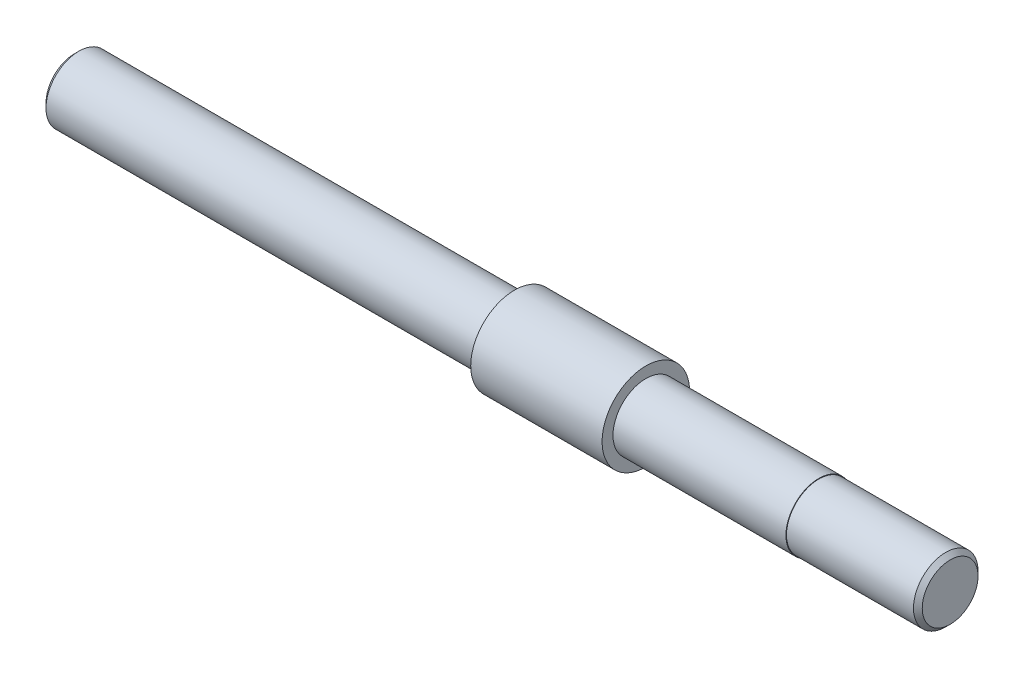
ISO-10303-21;
HEADER;
FILE_DESCRIPTION(('STEP AP214'),'2;1');
FILE_NAME('part.step','',(''),(''),'','','');
FILE_SCHEMA(('AUTOMOTIVE_DESIGN { 1 0 10303 214 1 1 1 1 }'));
ENDSEC;
DATA;
#1=APPLICATION_CONTEXT('core data for automotive mechanical design processes');
#2=APPLICATION_PROTOCOL_DEFINITION('international standard','automotive_design',2000,#1);
#3=PRODUCT_CONTEXT('',#1,'mechanical');
#4=PRODUCT('Part','Part','',(#3));
#5=PRODUCT_RELATED_PRODUCT_CATEGORY('part','',(#4));
#6=PRODUCT_DEFINITION_FORMATION('','',#4);
#7=PRODUCT_DEFINITION_CONTEXT('part definition',#1,'design');
#8=PRODUCT_DEFINITION('design','',#6,#7);
#9=PRODUCT_DEFINITION_SHAPE('','',#8);
#10=(LENGTH_UNIT() NAMED_UNIT(*) SI_UNIT(.MILLI.,.METRE.));
#11=(NAMED_UNIT(*) PLANE_ANGLE_UNIT() SI_UNIT($,.RADIAN.));
#12=(NAMED_UNIT(*) SI_UNIT($,.STERADIAN.) SOLID_ANGLE_UNIT());
#13=UNCERTAINTY_MEASURE_WITH_UNIT(LENGTH_MEASURE(1.E-05),#10,'distance_accuracy_value','');
#14=(GEOMETRIC_REPRESENTATION_CONTEXT(3) GLOBAL_UNCERTAINTY_ASSIGNED_CONTEXT((#13)) GLOBAL_UNIT_ASSIGNED_CONTEXT((#10,
#11,#12)) REPRESENTATION_CONTEXT('',''));
#15=CARTESIAN_POINT('',(0.,0.,0.));
#16=DIRECTION('',(0.,0.,1.));
#17=DIRECTION('',(1.,0.,0.));
#18=AXIS2_PLACEMENT_3D('',#15,#16,#17);
#19=CARTESIAN_POINT('',(0.,0.,0.));
#20=DIRECTION('',(-1.,0.,0.));
#21=DIRECTION('',(0.,0.,1.));
#22=AXIS2_PLACEMENT_3D('',#19,#20,#21);
#23=PLANE('',#22);
#24=CARTESIAN_POINT('',(0.,0.,0.));
#25=DIRECTION('',(-1.,0.,0.));
#26=DIRECTION('',(0.,0.,1.));
#27=AXIS2_PLACEMENT_3D('',#24,#25,#26);
#28=CIRCLE('',#27,1.275);
#29=CARTESIAN_POINT('',(0.,0.,1.275));
#30=VERTEX_POINT('',#29);
#31=EDGE_CURVE('E10',#30,#30,#28,.F.);
#32=ORIENTED_EDGE('',*,*,#31,.T.);
#33=EDGE_LOOP('',(#32));
#34=FACE_BOUND('',#33,.T.);
#35=ADVANCED_FACE('F38',(#34),#23,.F.);
#36=CARTESIAN_POINT('',(-12.0887675927148,0.,0.));
#37=DIRECTION('',(-1.,0.,0.));
#38=DIRECTION('',(0.,0.,1.));
#39=AXIS2_PLACEMENT_3D('',#36,#37,#38);
#40=CYLINDRICAL_SURFACE('',#39,1.475);
#41=CARTESIAN_POINT('',(-0.199999999999995,0.,0.));
#42=DIRECTION('',(-1.,0.,0.));
#43=DIRECTION('',(0.,0.,1.));
#44=AXIS2_PLACEMENT_3D('',#41,#42,#43);
#45=CIRCLE('',#44,1.475);
#46=CARTESIAN_POINT('',(-0.199999999999995,0.,1.475));
#47=VERTEX_POINT('',#46);
#48=EDGE_CURVE('E45',#47,#47,#45,.T.);
#49=ORIENTED_EDGE('',*,*,#48,.T.);
#50=EDGE_LOOP('',(#49));
#51=FACE_BOUND('',#50,.T.);
#52=CARTESIAN_POINT('',(-6.,0.,0.));
#53=DIRECTION('',(-1.,0.,0.));
#54=DIRECTION('',(0.,0.,1.));
#55=AXIS2_PLACEMENT_3D('',#52,#53,#54);
#56=CIRCLE('',#55,1.475);
#57=CARTESIAN_POINT('',(-6.,0.,1.475));
#58=VERTEX_POINT('',#57);
#59=EDGE_CURVE('E58',#58,#58,#56,.T.);
#60=ORIENTED_EDGE('',*,*,#59,.F.);
#61=EDGE_LOOP('',(#60));
#62=FACE_BOUND('',#61,.T.);
#63=ADVANCED_FACE('F106',(#51,#62),#40,.T.);
#64=CARTESIAN_POINT('',(-6.,1.475,0.));
#65=DIRECTION('',(-1.,0.,0.));
#66=DIRECTION('',(0.,0.,1.));
#67=AXIS2_PLACEMENT_3D('',#64,#65,#66);
#68=PLANE('',#67);
#69=CARTESIAN_POINT('',(-6.,0.,0.));
#70=DIRECTION('',(-1.,0.,0.));
#71=DIRECTION('',(0.,0.,1.));
#72=AXIS2_PLACEMENT_3D('',#69,#70,#71);
#73=CIRCLE('',#72,1.5);
#74=CARTESIAN_POINT('',(-6.,0.,1.5));
#75=VERTEX_POINT('',#74);
#76=EDGE_CURVE('E61',#75,#75,#73,.T.);
#77=ORIENTED_EDGE('',*,*,#76,.F.);
#78=EDGE_LOOP('',(#77));
#79=FACE_BOUND('',#78,.T.);
#80=ORIENTED_EDGE('',*,*,#59,.T.);
#81=EDGE_LOOP('',(#80));
#82=FACE_BOUND('',#81,.T.);
#83=ADVANCED_FACE('F100',(#79,#82),#68,.F.);
#84=CARTESIAN_POINT('',(-12.0887675927148,0.,0.));
#85=DIRECTION('',(-1.,0.,0.));
#86=DIRECTION('',(0.,0.,1.));
#87=AXIS2_PLACEMENT_3D('',#84,#85,#86);
#88=CYLINDRICAL_SURFACE('',#87,1.5);
#89=CARTESIAN_POINT('',(-13.9,0.,0.));
#90=DIRECTION('',(-1.,0.,0.));
#91=DIRECTION('',(0.,0.,1.));
#92=AXIS2_PLACEMENT_3D('',#89,#90,#91);
#93=CIRCLE('',#92,1.5);
#94=CARTESIAN_POINT('',(-13.9,0.,1.5));
#95=VERTEX_POINT('',#94);
#96=EDGE_CURVE('E64',#95,#95,#93,.T.);
#97=ORIENTED_EDGE('',*,*,#96,.F.);
#98=EDGE_LOOP('',(#97));
#99=FACE_BOUND('',#98,.T.);
#100=ORIENTED_EDGE('',*,*,#76,.T.);
#101=EDGE_LOOP('',(#100));
#102=FACE_BOUND('',#101,.T.);
#103=ADVANCED_FACE('F94',(#99,#102),#88,.T.);
#104=CARTESIAN_POINT('',(-13.9,1.5,0.));
#105=DIRECTION('',(-1.,0.,0.));
#106=DIRECTION('',(0.,0.,1.));
#107=AXIS2_PLACEMENT_3D('',#104,#105,#106);
#108=PLANE('',#107);
#109=CARTESIAN_POINT('',(-13.9,0.,0.));
#110=DIRECTION('',(-1.,0.,0.));
#111=DIRECTION('',(0.,0.,1.));
#112=AXIS2_PLACEMENT_3D('',#109,#110,#111);
#113=CIRCLE('',#112,2.);
#114=CARTESIAN_POINT('',(-13.9,0.,2.));
#115=VERTEX_POINT('',#114);
#116=EDGE_CURVE('E67',#115,#115,#113,.T.);
#117=ORIENTED_EDGE('',*,*,#116,.F.);
#118=EDGE_LOOP('',(#117));
#119=FACE_BOUND('',#118,.T.);
#120=ORIENTED_EDGE('',*,*,#96,.T.);
#121=EDGE_LOOP('',(#120));
#122=FACE_BOUND('',#121,.T.);
#123=ADVANCED_FACE('F88',(#119,#122),#108,.F.);
#124=CARTESIAN_POINT('',(-12.0887675927148,0.,0.));
#125=DIRECTION('',(-1.,0.,0.));
#126=DIRECTION('',(0.,0.,1.));
#127=AXIS2_PLACEMENT_3D('',#124,#125,#126);
#128=CYLINDRICAL_SURFACE('',#127,2.);
#129=CARTESIAN_POINT('',(-19.9,0.,0.));
#130=DIRECTION('',(-1.,0.,0.));
#131=DIRECTION('',(0.,0.,1.));
#132=AXIS2_PLACEMENT_3D('',#129,#130,#131);
#133=CIRCLE('',#132,2.);
#134=CARTESIAN_POINT('',(-19.9,0.,2.));
#135=VERTEX_POINT('',#134);
#136=EDGE_CURVE('E70',#135,#135,#133,.T.);
#137=ORIENTED_EDGE('',*,*,#136,.F.);
#138=EDGE_LOOP('',(#137));
#139=FACE_BOUND('',#138,.T.);
#140=ORIENTED_EDGE('',*,*,#116,.T.);
#141=EDGE_LOOP('',(#140));
#142=FACE_BOUND('',#141,.T.);
#143=ADVANCED_FACE('F82',(#139,#142),#128,.T.);
#144=CARTESIAN_POINT('',(-19.9,2.,0.));
#145=DIRECTION('',(1.,0.,0.));
#146=DIRECTION('',(0.,0.,-1.));
#147=AXIS2_PLACEMENT_3D('',#144,#145,#146);
#148=PLANE('',#147);
#149=CARTESIAN_POINT('',(-19.9,0.,0.));
#150=DIRECTION('',(-1.,0.,0.));
#151=DIRECTION('',(0.,0.,1.));
#152=AXIS2_PLACEMENT_3D('',#149,#150,#151);
#153=CIRCLE('',#152,1.5);
#154=CARTESIAN_POINT('',(-19.9,0.,1.5));
#155=VERTEX_POINT('',#154);
#156=EDGE_CURVE('E73',#155,#155,#153,.T.);
#157=ORIENTED_EDGE('',*,*,#156,.F.);
#158=EDGE_LOOP('',(#157));
#159=FACE_BOUND('',#158,.T.);
#160=ORIENTED_EDGE('',*,*,#136,.T.);
#161=EDGE_LOOP('',(#160));
#162=FACE_BOUND('',#161,.T.);
#163=ADVANCED_FACE('F79',(#159,#162),#148,.F.);
#164=CARTESIAN_POINT('',(-12.0887675927148,0.,0.));
#165=DIRECTION('',(-1.,0.,0.));
#166=DIRECTION('',(0.,0.,1.));
#167=AXIS2_PLACEMENT_3D('',#164,#165,#166);
#168=CYLINDRICAL_SURFACE('',#167,1.5);
#169=CARTESIAN_POINT('',(-39.8,0.,0.));
#170=DIRECTION('',(1.,0.,0.));
#171=DIRECTION('',(0.,0.,-1.));
#172=AXIS2_PLACEMENT_3D('',#169,#170,#171);
#173=CIRCLE('',#172,1.5);
#174=CARTESIAN_POINT('',(-39.8,0.,-1.5));
#175=VERTEX_POINT('',#174);
#176=EDGE_CURVE('E49',#175,#175,#173,.T.);
#177=ORIENTED_EDGE('',*,*,#176,.T.);
#178=EDGE_LOOP('',(#177));
#179=FACE_BOUND('',#178,.T.);
#180=ORIENTED_EDGE('',*,*,#156,.T.);
#181=EDGE_LOOP('',(#180));
#182=FACE_BOUND('',#181,.T.);
#183=ADVANCED_FACE('F77',(#179,#182),#168,.T.);
#184=CARTESIAN_POINT('',(-40.,1.5,0.));
#185=DIRECTION('',(1.,0.,0.));
#186=DIRECTION('',(0.,0.,-1.));
#187=AXIS2_PLACEMENT_3D('',#184,#185,#186);
#188=PLANE('',#187);
#189=CARTESIAN_POINT('',(-40.,0.,0.));
#190=DIRECTION('',(1.,0.,0.));
#191=DIRECTION('',(0.,0.,-1.));
#192=AXIS2_PLACEMENT_3D('',#189,#190,#191);
#193=CIRCLE('',#192,1.3);
#194=CARTESIAN_POINT('',(-40.,0.,-1.3));
#195=VERTEX_POINT('',#194);
#196=EDGE_CURVE('E53',#195,#195,#193,.F.);
#197=ORIENTED_EDGE('',*,*,#196,.T.);
#198=EDGE_LOOP('',(#197));
#199=FACE_BOUND('',#198,.T.);
#200=ADVANCED_FACE('F118',(#199),#188,.F.);
#201=CARTESIAN_POINT('',(-40.,0.,0.));
#202=DIRECTION('',(1.,0.,0.));
#203=DIRECTION('',(0.,0.,-1.));
#204=AXIS2_PLACEMENT_3D('',#201,#202,#203);
#205=CONICAL_SURFACE('',#204,1.3,0.785398163397451);
#206=ORIENTED_EDGE('',*,*,#176,.F.);
#207=EDGE_LOOP('',(#206));
#208=FACE_BOUND('',#207,.T.);
#209=ORIENTED_EDGE('',*,*,#196,.F.);
#210=EDGE_LOOP('',(#209));
#211=FACE_BOUND('',#210,.T.);
#212=ADVANCED_FACE('F116',(#208,#211),#205,.T.);
#213=CARTESIAN_POINT('',(-0.199999999999995,0.,0.));
#214=DIRECTION('',(-1.,0.,0.));
#215=DIRECTION('',(0.,0.,1.));
#216=AXIS2_PLACEMENT_3D('',#213,#214,#215);
#217=CONICAL_SURFACE('',#216,1.475,0.785398163397463);
#218=ORIENTED_EDGE('',*,*,#31,.F.);
#219=EDGE_LOOP('',(#218));
#220=FACE_BOUND('',#219,.T.);
#221=ORIENTED_EDGE('',*,*,#48,.F.);
#222=EDGE_LOOP('',(#221));
#223=FACE_BOUND('',#222,.T.);
#224=ADVANCED_FACE('F40',(#220,#223),#217,.T.);
#225=CLOSED_SHELL('',(#35,#63,#83,#103,#123,#143,#163,#183,#200,#212,#224));
#226=MANIFOLD_SOLID_BREP('B2',#225);
#227=ADVANCED_BREP_SHAPE_REPRESENTATION('',(#18,#226),#14);
#228=SHAPE_DEFINITION_REPRESENTATION(#9,#227);
ENDSEC;
END-ISO-10303-21;
